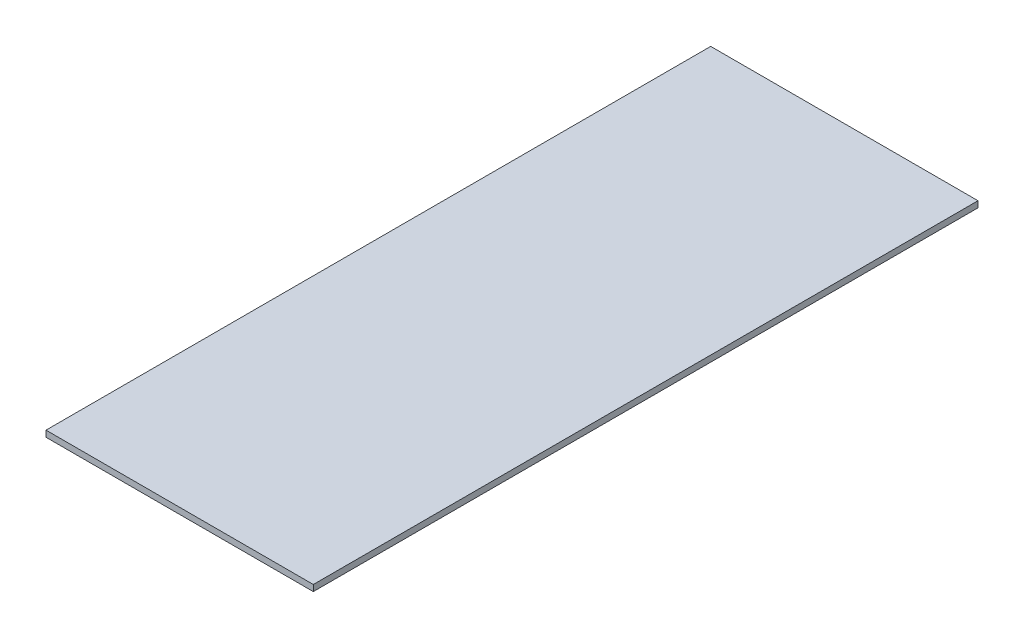
ISO-10303-21;
HEADER;
FILE_DESCRIPTION(('STEP AP214'),'2;1');
FILE_NAME('part.step','',(''),(''),'','','');
FILE_SCHEMA(('AUTOMOTIVE_DESIGN { 1 0 10303 214 1 1 1 1 }'));
ENDSEC;
DATA;
#1=APPLICATION_CONTEXT('core data for automotive mechanical design processes');
#2=APPLICATION_PROTOCOL_DEFINITION('international standard','automotive_design',2000,#1);
#3=PRODUCT_CONTEXT('',#1,'mechanical');
#4=PRODUCT('Part','Part','',(#3));
#5=PRODUCT_RELATED_PRODUCT_CATEGORY('part','',(#4));
#6=PRODUCT_DEFINITION_FORMATION('','',#4);
#7=PRODUCT_DEFINITION_CONTEXT('part definition',#1,'design');
#8=PRODUCT_DEFINITION('design','',#6,#7);
#9=PRODUCT_DEFINITION_SHAPE('','',#8);
#10=(LENGTH_UNIT() NAMED_UNIT(*) SI_UNIT(.MILLI.,.METRE.));
#11=(NAMED_UNIT(*) PLANE_ANGLE_UNIT() SI_UNIT($,.RADIAN.));
#12=(NAMED_UNIT(*) SI_UNIT($,.STERADIAN.) SOLID_ANGLE_UNIT());
#13=UNCERTAINTY_MEASURE_WITH_UNIT(LENGTH_MEASURE(1.E-05),#10,'distance_accuracy_value','');
#14=(GEOMETRIC_REPRESENTATION_CONTEXT(3) GLOBAL_UNCERTAINTY_ASSIGNED_CONTEXT((#13)) GLOBAL_UNIT_ASSIGNED_CONTEXT((#10,
#11,#12)) REPRESENTATION_CONTEXT('',''));
#15=CARTESIAN_POINT('',(0.,0.,0.));
#16=DIRECTION('',(0.,0.,1.));
#17=DIRECTION('',(1.,0.,0.));
#18=AXIS2_PLACEMENT_3D('',#15,#16,#17);
#19=CARTESIAN_POINT('',(120.65,5.588,300.));
#20=DIRECTION('',(-1.,0.,0.));
#21=DIRECTION('',(0.,0.,1.));
#22=AXIS2_PLACEMENT_3D('',#19,#20,#21);
#23=PLANE('',#22);
#24=DIRECTION('',(0.,0.,-1.));
#25=VECTOR('',#24,1.);
#26=CARTESIAN_POINT('',(120.65,0.,300.));
#27=LINE('',#26,#25);
#28=CARTESIAN_POINT('',(120.65,0.,300.));
#29=VERTEX_POINT('',#28);
#30=CARTESIAN_POINT('',(120.65,0.,-300.));
#31=VERTEX_POINT('',#30);
#32=EDGE_CURVE('E100',#29,#31,#27,.T.);
#33=ORIENTED_EDGE('',*,*,#32,.T.);
#34=DIRECTION('',(0.,-1.,0.));
#35=VECTOR('',#34,1.);
#36=CARTESIAN_POINT('',(120.65,5.588,-300.));
#37=LINE('',#36,#35);
#38=CARTESIAN_POINT('',(120.65,5.588,-300.));
#39=VERTEX_POINT('',#38);
#40=EDGE_CURVE('E11',#39,#31,#37,.T.);
#41=ORIENTED_EDGE('',*,*,#40,.F.);
#42=DIRECTION('',(0.,0.,-1.));
#43=VECTOR('',#42,1.);
#44=CARTESIAN_POINT('',(120.65,5.588,300.));
#45=LINE('',#44,#43);
#46=CARTESIAN_POINT('',(120.65,5.588,300.));
#47=VERTEX_POINT('',#46);
#48=EDGE_CURVE('E88',#47,#39,#45,.T.);
#49=ORIENTED_EDGE('',*,*,#48,.F.);
#50=DIRECTION('',(0.,-1.,0.));
#51=VECTOR('',#50,1.);
#52=CARTESIAN_POINT('',(120.65,5.588,300.));
#53=LINE('',#52,#51);
#54=EDGE_CURVE('E96',#47,#29,#53,.T.);
#55=ORIENTED_EDGE('',*,*,#54,.T.);
#56=EDGE_LOOP('',(#33,#41,#49,#55));
#57=FACE_BOUND('',#56,.T.);
#58=ADVANCED_FACE('F37',(#57),#23,.F.);
#59=CARTESIAN_POINT('',(-120.65,5.588,-300.));
#60=DIRECTION('',(0.,0.,1.));
#61=DIRECTION('',(1.,0.,0.));
#62=AXIS2_PLACEMENT_3D('',#59,#60,#61);
#63=PLANE('',#62);
#64=DIRECTION('',(-1.,0.,0.));
#65=VECTOR('',#64,1.);
#66=CARTESIAN_POINT('',(-120.65,0.,-300.));
#67=LINE('',#66,#65);
#68=CARTESIAN_POINT('',(-120.65,0.,-300.));
#69=VERTEX_POINT('',#68);
#70=EDGE_CURVE('E92',#31,#69,#67,.T.);
#71=ORIENTED_EDGE('',*,*,#70,.T.);
#72=DIRECTION('',(0.,-1.,0.));
#73=VECTOR('',#72,1.);
#74=CARTESIAN_POINT('',(-120.65,5.588,-300.));
#75=LINE('',#74,#73);
#76=CARTESIAN_POINT('',(-120.65,5.588,-300.));
#77=VERTEX_POINT('',#76);
#78=EDGE_CURVE('E45',#77,#69,#75,.T.);
#79=ORIENTED_EDGE('',*,*,#78,.F.);
#80=DIRECTION('',(-1.,0.,0.));
#81=VECTOR('',#80,1.);
#82=CARTESIAN_POINT('',(-120.65,5.588,-300.));
#83=LINE('',#82,#81);
#84=EDGE_CURVE('E83',#39,#77,#83,.T.);
#85=ORIENTED_EDGE('',*,*,#84,.F.);
#86=ORIENTED_EDGE('',*,*,#40,.T.);
#87=EDGE_LOOP('',(#71,#79,#85,#86));
#88=FACE_BOUND('',#87,.T.);
#89=ADVANCED_FACE('F91',(#88),#63,.F.);
#90=CARTESIAN_POINT('',(-120.65,5.588,300.));
#91=DIRECTION('',(1.,0.,0.));
#92=DIRECTION('',(0.,0.,-1.));
#93=AXIS2_PLACEMENT_3D('',#90,#91,#92);
#94=PLANE('',#93);
#95=DIRECTION('',(0.,0.,1.));
#96=VECTOR('',#95,1.);
#97=CARTESIAN_POINT('',(-120.65,0.,300.));
#98=LINE('',#97,#96);
#99=CARTESIAN_POINT('',(-120.65,0.,300.));
#100=VERTEX_POINT('',#99);
#101=EDGE_CURVE('E70',#69,#100,#98,.T.);
#102=ORIENTED_EDGE('',*,*,#101,.T.);
#103=DIRECTION('',(0.,-1.,0.));
#104=VECTOR('',#103,1.);
#105=CARTESIAN_POINT('',(-120.65,5.588,300.));
#106=LINE('',#105,#104);
#107=CARTESIAN_POINT('',(-120.65,5.588,300.));
#108=VERTEX_POINT('',#107);
#109=EDGE_CURVE('E93',#108,#100,#106,.T.);
#110=ORIENTED_EDGE('',*,*,#109,.F.);
#111=DIRECTION('',(0.,0.,1.));
#112=VECTOR('',#111,1.);
#113=CARTESIAN_POINT('',(-120.65,5.588,300.));
#114=LINE('',#113,#112);
#115=EDGE_CURVE('E86',#77,#108,#114,.T.);
#116=ORIENTED_EDGE('',*,*,#115,.F.);
#117=ORIENTED_EDGE('',*,*,#78,.T.);
#118=EDGE_LOOP('',(#102,#110,#116,#117));
#119=FACE_BOUND('',#118,.T.);
#120=ADVANCED_FACE('F94',(#119),#94,.F.);
#121=CARTESIAN_POINT('',(-120.65,5.588,300.));
#122=DIRECTION('',(0.,0.,-1.));
#123=DIRECTION('',(-1.,0.,0.));
#124=AXIS2_PLACEMENT_3D('',#121,#122,#123);
#125=PLANE('',#124);
#126=DIRECTION('',(1.,0.,0.));
#127=VECTOR('',#126,1.);
#128=CARTESIAN_POINT('',(-120.65,0.,300.));
#129=LINE('',#128,#127);
#130=EDGE_CURVE('E76',#100,#29,#129,.T.);
#131=ORIENTED_EDGE('',*,*,#130,.T.);
#132=ORIENTED_EDGE('',*,*,#54,.F.);
#133=DIRECTION('',(1.,0.,0.));
#134=VECTOR('',#133,1.);
#135=CARTESIAN_POINT('',(-120.65,5.588,300.));
#136=LINE('',#135,#134);
#137=EDGE_CURVE('E53',#108,#47,#136,.T.);
#138=ORIENTED_EDGE('',*,*,#137,.F.);
#139=ORIENTED_EDGE('',*,*,#109,.T.);
#140=EDGE_LOOP('',(#131,#132,#138,#139));
#141=FACE_BOUND('',#140,.T.);
#142=ADVANCED_FACE('F107',(#141),#125,.F.);
#143=CARTESIAN_POINT('',(0.,5.588,0.));
#144=DIRECTION('',(0.,-1.,0.));
#145=DIRECTION('',(0.,0.,-1.));
#146=AXIS2_PLACEMENT_3D('',#143,#144,#145);
#147=PLANE('',#146);
#148=ORIENTED_EDGE('',*,*,#48,.T.);
#149=ORIENTED_EDGE('',*,*,#84,.T.);
#150=ORIENTED_EDGE('',*,*,#115,.T.);
#151=ORIENTED_EDGE('',*,*,#137,.T.);
#152=EDGE_LOOP('',(#148,#149,#150,#151));
#153=FACE_BOUND('',#152,.T.);
#154=ADVANCED_FACE('F84',(#153),#147,.F.);
#155=CARTESIAN_POINT('',(0.,0.,0.));
#156=DIRECTION('',(0.,-1.,0.));
#157=DIRECTION('',(0.,0.,-1.));
#158=AXIS2_PLACEMENT_3D('',#155,#156,#157);
#159=PLANE('',#158);
#160=ORIENTED_EDGE('',*,*,#32,.F.);
#161=ORIENTED_EDGE('',*,*,#130,.F.);
#162=ORIENTED_EDGE('',*,*,#101,.F.);
#163=ORIENTED_EDGE('',*,*,#70,.F.);
#164=EDGE_LOOP('',(#160,#161,#162,#163));
#165=FACE_BOUND('',#164,.T.);
#166=ADVANCED_FACE('F110',(#165),#159,.T.);
#167=CLOSED_SHELL('',(#58,#89,#120,#142,#154,#166));
#168=MANIFOLD_SOLID_BREP('B2',#167);
#169=ADVANCED_BREP_SHAPE_REPRESENTATION('',(#18,#168),#14);
#170=SHAPE_DEFINITION_REPRESENTATION(#9,#169);
ENDSEC;
END-ISO-10303-21;
